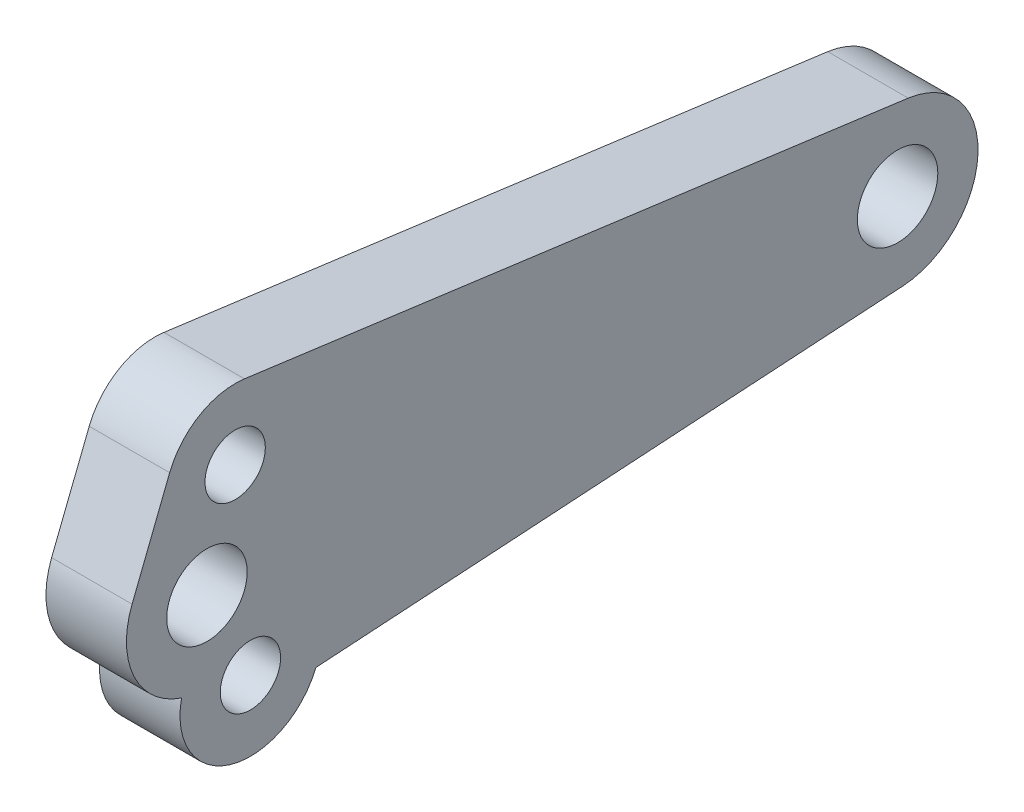
ISO-10303-21;
HEADER;
FILE_DESCRIPTION(('STEP AP214'),'2;1');
FILE_NAME('part.step','',(''),(''),'','','');
FILE_SCHEMA(('AUTOMOTIVE_DESIGN { 1 0 10303 214 1 1 1 1 }'));
ENDSEC;
DATA;
#1=APPLICATION_CONTEXT('core data for automotive mechanical design processes');
#2=APPLICATION_PROTOCOL_DEFINITION('international standard','automotive_design',2000,#1);
#3=PRODUCT_CONTEXT('',#1,'mechanical');
#4=PRODUCT('Part','Part','',(#3));
#5=PRODUCT_RELATED_PRODUCT_CATEGORY('part','',(#4));
#6=PRODUCT_DEFINITION_FORMATION('','',#4);
#7=PRODUCT_DEFINITION_CONTEXT('part definition',#1,'design');
#8=PRODUCT_DEFINITION('design','',#6,#7);
#9=PRODUCT_DEFINITION_SHAPE('','',#8);
#10=(LENGTH_UNIT() NAMED_UNIT(*) SI_UNIT(.MILLI.,.METRE.));
#11=(NAMED_UNIT(*) PLANE_ANGLE_UNIT() SI_UNIT($,.RADIAN.));
#12=(NAMED_UNIT(*) SI_UNIT($,.STERADIAN.) SOLID_ANGLE_UNIT());
#13=UNCERTAINTY_MEASURE_WITH_UNIT(LENGTH_MEASURE(1.E-05),#10,'distance_accuracy_value','');
#14=(GEOMETRIC_REPRESENTATION_CONTEXT(3) GLOBAL_UNCERTAINTY_ASSIGNED_CONTEXT((#13)) GLOBAL_UNIT_ASSIGNED_CONTEXT((#10,
#11,#12)) REPRESENTATION_CONTEXT('',''));
#15=CARTESIAN_POINT('',(0.,0.,0.));
#16=DIRECTION('',(0.,0.,1.));
#17=DIRECTION('',(1.,0.,0.));
#18=AXIS2_PLACEMENT_3D('',#15,#16,#17);
#19=CARTESIAN_POINT('',(2.,2.45323711491328,-0.701399079253571));
#20=DIRECTION('',(1.,0.,0.));
#21=DIRECTION('',(0.,0.,-1.));
#22=AXIS2_PLACEMENT_3D('',#19,#20,#21);
#23=PLANE('',#22);
#24=CARTESIAN_POINT('',(2.,2.45323711491328,-0.701399079253571));
#25=DIRECTION('',(1.,0.,0.));
#26=DIRECTION('',(0.,0.,-1.));
#27=AXIS2_PLACEMENT_3D('',#24,#25,#26);
#28=CIRCLE('',#27,0.75);
#29=CARTESIAN_POINT('',(2.,2.45323711491328,-1.45139907925357));
#30=VERTEX_POINT('',#29);
#31=EDGE_CURVE('E200',#30,#30,#28,.T.);
#32=ORIENTED_EDGE('',*,*,#31,.F.);
#33=EDGE_LOOP('',(#32));
#34=FACE_BOUND('',#33,.T.);
#35=CARTESIAN_POINT('',(2.,0.,0.));
#36=DIRECTION('',(1.,0.,0.));
#37=DIRECTION('',(0.,0.,-1.));
#38=AXIS2_PLACEMENT_3D('',#35,#36,#37);
#39=CIRCLE('',#38,1.);
#40=CARTESIAN_POINT('',(2.,0.,-1.));
#41=VERTEX_POINT('',#40);
#42=EDGE_CURVE('E140',#41,#41,#39,.T.);
#43=ORIENTED_EDGE('',*,*,#42,.F.);
#44=EDGE_LOOP('',(#43));
#45=FACE_BOUND('',#44,.T.);
#46=CARTESIAN_POINT('',(2.,2.45323711491328,-0.701399079253571));
#47=DIRECTION('',(1.,0.,0.));
#48=DIRECTION('',(0.,0.,-1.));
#49=AXIS2_PLACEMENT_3D('',#46,#47,#48);
#50=CIRCLE('',#49,1.75);
#51=CARTESIAN_POINT('',(2.,4.1877997157229,-0.933331362199626));
#52=VERTEX_POINT('',#51);
#53=CARTESIAN_POINT('',(2.,3.09684471709223,0.925951299250538));
#54=VERTEX_POINT('',#53);
#55=EDGE_CURVE('E155',#52,#54,#50,.T.);
#56=ORIENTED_EDGE('',*,*,#55,.T.);
#57=DIRECTION('',(0.,-0.929914502002348,0.367775772673683));
#58=VECTOR('',#57,1.);
#59=CARTESIAN_POINT('',(2.,3.09684471709223,0.925951299250538));
#60=LINE('',#59,#58);
#61=CARTESIAN_POINT('',(2.,0.735551545347367,1.8598290040047));
#62=VERTEX_POINT('',#61);
#63=EDGE_CURVE('E97',#54,#62,#60,.T.);
#64=ORIENTED_EDGE('',*,*,#63,.T.);
#65=CARTESIAN_POINT('',(2.,0.,0.));
#66=DIRECTION('',(1.,0.,0.));
#67=DIRECTION('',(0.,0.,-1.));
#68=AXIS2_PLACEMENT_3D('',#65,#66,#67);
#69=CIRCLE('',#68,2.);
#70=CARTESIAN_POINT('',(2.,-1.89794479683448,0.630718279558265));
#71=VERTEX_POINT('',#70);
#72=EDGE_CURVE('E172',#62,#71,#69,.T.);
#73=ORIENTED_EDGE('',*,*,#72,.T.);
#74=CARTESIAN_POINT('',(2.,-2.26193109555407,-1.08101007924882));
#75=DIRECTION('',(1.,0.,0.));
#76=DIRECTION('',(0.,0.,-1.));
#77=AXIS2_PLACEMENT_3D('',#74,#75,#76);
#78=CIRCLE('',#77,1.75);
#79=CARTESIAN_POINT('',(2.,-2.91139936514957,-2.70603037659548));
#80=VERTEX_POINT('',#79);
#81=EDGE_CURVE('E113',#71,#80,#78,.T.);
#82=ORIENTED_EDGE('',*,*,#81,.T.);
#83=DIRECTION('',(0.,0.0626500320146825,-0.998035557226575));
#84=VECTOR('',#83,1.);
#85=CARTESIAN_POINT('',(2.,-2.91139936514957,-2.70603037659548));
#86=LINE('',#85,#84);
#87=CARTESIAN_POINT('',(2.,-1.99607111445315,-17.2875096089594));
#88=VERTEX_POINT('',#87);
#89=EDGE_CURVE('E107',#80,#88,#86,.T.);
#90=ORIENTED_EDGE('',*,*,#89,.T.);
#91=CARTESIAN_POINT('',(2.,0.,-17.16220954493));
#92=DIRECTION('',(1.,0.,0.));
#93=DIRECTION('',(0.,0.,-1.));
#94=AXIS2_PLACEMENT_3D('',#91,#92,#93);
#95=CIRCLE('',#94,2.);
#96=CARTESIAN_POINT('',(2.,1.98235725806814,-17.4272750111541));
#97=VERTEX_POINT('',#96);
#98=EDGE_CURVE('E111',#88,#97,#95,.T.);
#99=ORIENTED_EDGE('',*,*,#98,.T.);
#100=DIRECTION('',(0.,0.132532733112032,0.991178629034068));
#101=VECTOR('',#100,1.);
#102=CARTESIAN_POINT('',(2.,4.1877997157229,-0.933331362199626));
#103=LINE('',#102,#101);
#104=EDGE_CURVE('E57',#97,#52,#103,.T.);
#105=ORIENTED_EDGE('',*,*,#104,.T.);
#106=EDGE_LOOP('',(#56,#64,#73,#82,#90,#99,#105));
#107=FACE_BOUND('',#106,.T.);
#108=CARTESIAN_POINT('',(2.,0.,-17.16220954493));
#109=DIRECTION('',(1.,0.,0.));
#110=DIRECTION('',(0.,0.,-1.));
#111=AXIS2_PLACEMENT_3D('',#108,#109,#110);
#112=CIRCLE('',#111,1.);
#113=CARTESIAN_POINT('',(2.,0.,-18.16220954493));
#114=VERTEX_POINT('',#113);
#115=EDGE_CURVE('E192',#114,#114,#112,.T.);
#116=ORIENTED_EDGE('',*,*,#115,.F.);
#117=EDGE_LOOP('',(#116));
#118=FACE_BOUND('',#117,.T.);
#119=CARTESIAN_POINT('',(2.,-2.26193109555407,-1.08101007924882));
#120=DIRECTION('',(1.,0.,0.));
#121=DIRECTION('',(0.,0.,-1.));
#122=AXIS2_PLACEMENT_3D('',#119,#120,#121);
#123=CIRCLE('',#122,0.75);
#124=CARTESIAN_POINT('',(2.,-2.26193109555407,-1.83101007924882));
#125=VERTEX_POINT('',#124);
#126=EDGE_CURVE('E208',#125,#125,#123,.T.);
#127=ORIENTED_EDGE('',*,*,#126,.F.);
#128=EDGE_LOOP('',(#127));
#129=FACE_BOUND('',#128,.T.);
#130=ADVANCED_FACE('F39',(#34,#45,#107,#118,#129),#23,.T.);
#131=CARTESIAN_POINT('',(0.,2.45323711491328,-0.701399079253571));
#132=DIRECTION('',(1.,0.,0.));
#133=DIRECTION('',(0.,0.,-1.));
#134=AXIS2_PLACEMENT_3D('',#131,#132,#133);
#135=PLANE('',#134);
#136=CARTESIAN_POINT('',(0.,2.45323711491328,-0.701399079253571));
#137=DIRECTION('',(1.,0.,0.));
#138=DIRECTION('',(0.,0.,-1.));
#139=AXIS2_PLACEMENT_3D('',#136,#137,#138);
#140=CIRCLE('',#139,1.75);
#141=CARTESIAN_POINT('',(0.,4.1877997157229,-0.933331362199626));
#142=VERTEX_POINT('',#141);
#143=CARTESIAN_POINT('',(0.,3.09684471709223,0.925951299250538));
#144=VERTEX_POINT('',#143);
#145=EDGE_CURVE('E135',#142,#144,#140,.T.);
#146=ORIENTED_EDGE('',*,*,#145,.F.);
#147=DIRECTION('',(0.,0.132532733112032,0.991178629034068));
#148=VECTOR('',#147,1.);
#149=CARTESIAN_POINT('',(0.,4.1877997157229,-0.933331362199626));
#150=LINE('',#149,#148);
#151=CARTESIAN_POINT('',(0.,1.98235725806814,-17.4272750111541));
#152=VERTEX_POINT('',#151);
#153=EDGE_CURVE('E89',#152,#142,#150,.T.);
#154=ORIENTED_EDGE('',*,*,#153,.F.);
#155=CARTESIAN_POINT('',(0.,0.,-17.16220954493));
#156=DIRECTION('',(1.,0.,0.));
#157=DIRECTION('',(0.,0.,-1.));
#158=AXIS2_PLACEMENT_3D('',#155,#156,#157);
#159=CIRCLE('',#158,2.);
#160=CARTESIAN_POINT('',(0.,-1.99607111445315,-17.2875096089594));
#161=VERTEX_POINT('',#160);
#162=EDGE_CURVE('E83',#161,#152,#159,.T.);
#163=ORIENTED_EDGE('',*,*,#162,.F.);
#164=DIRECTION('',(0.,0.0626500320146825,-0.998035557226575));
#165=VECTOR('',#164,1.);
#166=CARTESIAN_POINT('',(0.,-2.91139936514957,-2.70603037659548));
#167=LINE('',#166,#165);
#168=CARTESIAN_POINT('',(0.,-2.91139936514957,-2.70603037659548));
#169=VERTEX_POINT('',#168);
#170=EDGE_CURVE('E122',#169,#161,#167,.T.);
#171=ORIENTED_EDGE('',*,*,#170,.F.);
#172=CARTESIAN_POINT('',(0.,-2.26193109555407,-1.08101007924882));
#173=DIRECTION('',(1.,0.,0.));
#174=DIRECTION('',(0.,0.,-1.));
#175=AXIS2_PLACEMENT_3D('',#172,#173,#174);
#176=CIRCLE('',#175,1.75);
#177=CARTESIAN_POINT('',(0.,-1.89794479683448,0.630718279558265));
#178=VERTEX_POINT('',#177);
#179=EDGE_CURVE('E146',#178,#169,#176,.T.);
#180=ORIENTED_EDGE('',*,*,#179,.F.);
#181=CARTESIAN_POINT('',(0.,0.,0.));
#182=DIRECTION('',(1.,0.,0.));
#183=DIRECTION('',(0.,0.,-1.));
#184=AXIS2_PLACEMENT_3D('',#181,#182,#183);
#185=CIRCLE('',#184,2.);
#186=CARTESIAN_POINT('',(0.,0.735551545347367,1.8598290040047));
#187=VERTEX_POINT('',#186);
#188=EDGE_CURVE('E143',#187,#178,#185,.T.);
#189=ORIENTED_EDGE('',*,*,#188,.F.);
#190=DIRECTION('',(0.,-0.929914502002348,0.367775772673683));
#191=VECTOR('',#190,1.);
#192=CARTESIAN_POINT('',(0.,3.09684471709223,0.925951299250538));
#193=LINE('',#192,#191);
#194=EDGE_CURVE('E139',#144,#187,#193,.T.);
#195=ORIENTED_EDGE('',*,*,#194,.F.);
#196=EDGE_LOOP('',(#146,#154,#163,#171,#180,#189,#195));
#197=FACE_BOUND('',#196,.T.);
#198=CARTESIAN_POINT('',(0.,0.,0.));
#199=DIRECTION('',(1.,0.,0.));
#200=DIRECTION('',(0.,0.,-1.));
#201=AXIS2_PLACEMENT_3D('',#198,#199,#200);
#202=CIRCLE('',#201,1.);
#203=CARTESIAN_POINT('',(0.,0.,-1.));
#204=VERTEX_POINT('',#203);
#205=EDGE_CURVE('E188',#204,#204,#202,.T.);
#206=ORIENTED_EDGE('',*,*,#205,.T.);
#207=EDGE_LOOP('',(#206));
#208=FACE_BOUND('',#207,.T.);
#209=CARTESIAN_POINT('',(0.,0.,-17.16220954493));
#210=DIRECTION('',(1.,0.,0.));
#211=DIRECTION('',(0.,0.,-1.));
#212=AXIS2_PLACEMENT_3D('',#209,#210,#211);
#213=CIRCLE('',#212,1.);
#214=CARTESIAN_POINT('',(0.,0.,-18.16220954493));
#215=VERTEX_POINT('',#214);
#216=EDGE_CURVE('E196',#215,#215,#213,.T.);
#217=ORIENTED_EDGE('',*,*,#216,.T.);
#218=EDGE_LOOP('',(#217));
#219=FACE_BOUND('',#218,.T.);
#220=CARTESIAN_POINT('',(0.,2.45323711491328,-0.701399079253571));
#221=DIRECTION('',(1.,0.,0.));
#222=DIRECTION('',(0.,0.,-1.));
#223=AXIS2_PLACEMENT_3D('',#220,#221,#222);
#224=CIRCLE('',#223,0.75);
#225=CARTESIAN_POINT('',(0.,2.45323711491328,-1.45139907925357));
#226=VERTEX_POINT('',#225);
#227=EDGE_CURVE('E204',#226,#226,#224,.T.);
#228=ORIENTED_EDGE('',*,*,#227,.T.);
#229=EDGE_LOOP('',(#228));
#230=FACE_BOUND('',#229,.T.);
#231=CARTESIAN_POINT('',(0.,-2.26193109555407,-1.08101007924882));
#232=DIRECTION('',(1.,0.,0.));
#233=DIRECTION('',(0.,0.,-1.));
#234=AXIS2_PLACEMENT_3D('',#231,#232,#233);
#235=CIRCLE('',#234,0.75);
#236=CARTESIAN_POINT('',(0.,-2.26193109555407,-1.83101007924882));
#237=VERTEX_POINT('',#236);
#238=EDGE_CURVE('E212',#237,#237,#235,.T.);
#239=ORIENTED_EDGE('',*,*,#238,.T.);
#240=EDGE_LOOP('',(#239));
#241=FACE_BOUND('',#240,.T.);
#242=ADVANCED_FACE('F176',(#197,#208,#219,#230,#241),#135,.F.);
#243=CARTESIAN_POINT('',(2.,2.45323711491328,-0.701399079253571));
#244=DIRECTION('',(-1.,0.,0.));
#245=DIRECTION('',(0.,0.,1.));
#246=AXIS2_PLACEMENT_3D('',#243,#244,#245);
#247=CYLINDRICAL_SURFACE('',#246,1.75);
#248=ORIENTED_EDGE('',*,*,#145,.T.);
#249=DIRECTION('',(-1.,0.,0.));
#250=VECTOR('',#249,1.);
#251=CARTESIAN_POINT('',(2.,3.09684471709223,0.925951299250538));
#252=LINE('',#251,#250);
#253=EDGE_CURVE('E11',#54,#144,#252,.T.);
#254=ORIENTED_EDGE('',*,*,#253,.F.);
#255=ORIENTED_EDGE('',*,*,#55,.F.);
#256=DIRECTION('',(-1.,0.,0.));
#257=VECTOR('',#256,1.);
#258=CARTESIAN_POINT('',(2.,4.1877997157229,-0.933331362199626));
#259=LINE('',#258,#257);
#260=EDGE_CURVE('E131',#52,#142,#259,.T.);
#261=ORIENTED_EDGE('',*,*,#260,.T.);
#262=EDGE_LOOP('',(#248,#254,#255,#261));
#263=FACE_BOUND('',#262,.T.);
#264=ADVANCED_FACE('F41',(#263),#247,.T.);
#265=CARTESIAN_POINT('',(2.,3.09684471709223,0.925951299250538));
#266=DIRECTION('',(0.,-0.367775772673683,-0.929914502002348));
#267=DIRECTION('',(0.,0.929914502002348,-0.367775772673683));
#268=AXIS2_PLACEMENT_3D('',#265,#266,#267);
#269=PLANE('',#268);
#270=ORIENTED_EDGE('',*,*,#194,.T.);
#271=DIRECTION('',(-1.,0.,0.));
#272=VECTOR('',#271,1.);
#273=CARTESIAN_POINT('',(2.,0.735551545347367,1.8598290040047));
#274=LINE('',#273,#272);
#275=EDGE_CURVE('E49',#62,#187,#274,.T.);
#276=ORIENTED_EDGE('',*,*,#275,.F.);
#277=ORIENTED_EDGE('',*,*,#63,.F.);
#278=ORIENTED_EDGE('',*,*,#253,.T.);
#279=EDGE_LOOP('',(#270,#276,#277,#278));
#280=FACE_BOUND('',#279,.T.);
#281=ADVANCED_FACE('F246',(#280),#269,.F.);
#282=CARTESIAN_POINT('',(2.,0.,0.));
#283=DIRECTION('',(-1.,0.,0.));
#284=DIRECTION('',(0.,0.,1.));
#285=AXIS2_PLACEMENT_3D('',#282,#283,#284);
#286=CYLINDRICAL_SURFACE('',#285,2.);
#287=ORIENTED_EDGE('',*,*,#188,.T.);
#288=DIRECTION('',(-1.,0.,0.));
#289=VECTOR('',#288,1.);
#290=CARTESIAN_POINT('',(2.,-1.89794479683448,0.630718279558265));
#291=LINE('',#290,#289);
#292=EDGE_CURVE('E162',#71,#178,#291,.T.);
#293=ORIENTED_EDGE('',*,*,#292,.F.);
#294=ORIENTED_EDGE('',*,*,#72,.F.);
#295=ORIENTED_EDGE('',*,*,#275,.T.);
#296=EDGE_LOOP('',(#287,#293,#294,#295));
#297=FACE_BOUND('',#296,.T.);
#298=ADVANCED_FACE('F170',(#297),#286,.T.);
#299=CARTESIAN_POINT('',(2.,-2.26193109555407,-1.08101007924882));
#300=DIRECTION('',(-1.,0.,0.));
#301=DIRECTION('',(0.,0.,1.));
#302=AXIS2_PLACEMENT_3D('',#299,#300,#301);
#303=CYLINDRICAL_SURFACE('',#302,1.75);
#304=ORIENTED_EDGE('',*,*,#179,.T.);
#305=DIRECTION('',(-1.,0.,0.));
#306=VECTOR('',#305,1.);
#307=CARTESIAN_POINT('',(2.,-2.91139936514957,-2.70603037659548));
#308=LINE('',#307,#306);
#309=EDGE_CURVE('E124',#80,#169,#308,.T.);
#310=ORIENTED_EDGE('',*,*,#309,.F.);
#311=ORIENTED_EDGE('',*,*,#81,.F.);
#312=ORIENTED_EDGE('',*,*,#292,.T.);
#313=EDGE_LOOP('',(#304,#310,#311,#312));
#314=FACE_BOUND('',#313,.T.);
#315=ADVANCED_FACE('F179',(#314),#303,.T.);
#316=CARTESIAN_POINT('',(2.,-2.91139936514957,-2.70603037659548));
#317=DIRECTION('',(0.,0.998035557226575,0.0626500320146825));
#318=DIRECTION('',(0.,-0.0626500320146825,0.998035557226575));
#319=AXIS2_PLACEMENT_3D('',#316,#317,#318);
#320=PLANE('',#319);
#321=ORIENTED_EDGE('',*,*,#170,.T.);
#322=DIRECTION('',(-1.,0.,0.));
#323=VECTOR('',#322,1.);
#324=CARTESIAN_POINT('',(2.,-1.99607111445315,-17.2875096089594));
#325=LINE('',#324,#323);
#326=EDGE_CURVE('E119',#88,#161,#325,.T.);
#327=ORIENTED_EDGE('',*,*,#326,.F.);
#328=ORIENTED_EDGE('',*,*,#89,.F.);
#329=ORIENTED_EDGE('',*,*,#309,.T.);
#330=EDGE_LOOP('',(#321,#327,#328,#329));
#331=FACE_BOUND('',#330,.T.);
#332=ADVANCED_FACE('F120',(#331),#320,.F.);
#333=CARTESIAN_POINT('',(2.,0.,-17.16220954493));
#334=DIRECTION('',(-1.,0.,0.));
#335=DIRECTION('',(0.,0.,1.));
#336=AXIS2_PLACEMENT_3D('',#333,#334,#335);
#337=CYLINDRICAL_SURFACE('',#336,2.);
#338=ORIENTED_EDGE('',*,*,#162,.T.);
#339=DIRECTION('',(-1.,0.,0.));
#340=VECTOR('',#339,1.);
#341=CARTESIAN_POINT('',(2.,1.98235725806814,-17.4272750111541));
#342=LINE('',#341,#340);
#343=EDGE_CURVE('E125',#97,#152,#342,.T.);
#344=ORIENTED_EDGE('',*,*,#343,.F.);
#345=ORIENTED_EDGE('',*,*,#98,.F.);
#346=ORIENTED_EDGE('',*,*,#326,.T.);
#347=EDGE_LOOP('',(#338,#344,#345,#346));
#348=FACE_BOUND('',#347,.T.);
#349=ADVANCED_FACE('F127',(#348),#337,.T.);
#350=CARTESIAN_POINT('',(2.,4.1877997157229,-0.933331362199626));
#351=DIRECTION('',(0.,-0.991178629034068,0.132532733112032));
#352=DIRECTION('',(0.,-0.132532733112032,-0.991178629034068));
#353=AXIS2_PLACEMENT_3D('',#350,#351,#352);
#354=PLANE('',#353);
#355=ORIENTED_EDGE('',*,*,#153,.T.);
#356=ORIENTED_EDGE('',*,*,#260,.F.);
#357=ORIENTED_EDGE('',*,*,#104,.F.);
#358=ORIENTED_EDGE('',*,*,#343,.T.);
#359=EDGE_LOOP('',(#355,#356,#357,#358));
#360=FACE_BOUND('',#359,.T.);
#361=ADVANCED_FACE('F236',(#360),#354,.F.);
#362=CARTESIAN_POINT('',(2.,0.,0.));
#363=DIRECTION('',(-1.,0.,0.));
#364=DIRECTION('',(0.,0.,1.));
#365=AXIS2_PLACEMENT_3D('',#362,#363,#364);
#366=CYLINDRICAL_SURFACE('',#365,1.);
#367=ORIENTED_EDGE('',*,*,#42,.T.);
#368=EDGE_LOOP('',(#367));
#369=FACE_BOUND('',#368,.T.);
#370=ORIENTED_EDGE('',*,*,#205,.F.);
#371=EDGE_LOOP('',(#370));
#372=FACE_BOUND('',#371,.T.);
#373=ADVANCED_FACE('F233',(#369,#372),#366,.F.);
#374=CARTESIAN_POINT('',(2.,0.,-17.16220954493));
#375=DIRECTION('',(-1.,0.,0.));
#376=DIRECTION('',(0.,0.,1.));
#377=AXIS2_PLACEMENT_3D('',#374,#375,#376);
#378=CYLINDRICAL_SURFACE('',#377,1.);
#379=ORIENTED_EDGE('',*,*,#115,.T.);
#380=EDGE_LOOP('',(#379));
#381=FACE_BOUND('',#380,.T.);
#382=ORIENTED_EDGE('',*,*,#216,.F.);
#383=EDGE_LOOP('',(#382));
#384=FACE_BOUND('',#383,.T.);
#385=ADVANCED_FACE('F305',(#381,#384),#378,.F.);
#386=CARTESIAN_POINT('',(2.,2.45323711491328,-0.701399079253571));
#387=DIRECTION('',(-1.,0.,0.));
#388=DIRECTION('',(0.,0.,1.));
#389=AXIS2_PLACEMENT_3D('',#386,#387,#388);
#390=CYLINDRICAL_SURFACE('',#389,0.75);
#391=ORIENTED_EDGE('',*,*,#31,.T.);
#392=EDGE_LOOP('',(#391));
#393=FACE_BOUND('',#392,.T.);
#394=ORIENTED_EDGE('',*,*,#227,.F.);
#395=EDGE_LOOP('',(#394));
#396=FACE_BOUND('',#395,.T.);
#397=ADVANCED_FACE('F313',(#393,#396),#390,.F.);
#398=CARTESIAN_POINT('',(2.,-2.26193109555407,-1.08101007924882));
#399=DIRECTION('',(-1.,0.,0.));
#400=DIRECTION('',(0.,0.,1.));
#401=AXIS2_PLACEMENT_3D('',#398,#399,#400);
#402=CYLINDRICAL_SURFACE('',#401,0.75);
#403=ORIENTED_EDGE('',*,*,#126,.T.);
#404=EDGE_LOOP('',(#403));
#405=FACE_BOUND('',#404,.T.);
#406=ORIENTED_EDGE('',*,*,#238,.F.);
#407=EDGE_LOOP('',(#406));
#408=FACE_BOUND('',#407,.T.);
#409=ADVANCED_FACE('F220',(#405,#408),#402,.F.);
#410=CLOSED_SHELL('',(#130,#242,#264,#281,#298,#315,#332,#349,#361,#373,#385,#397,#409));
#411=MANIFOLD_SOLID_BREP('B2',#410);
#412=ADVANCED_BREP_SHAPE_REPRESENTATION('',(#18,#411),#14);
#413=SHAPE_DEFINITION_REPRESENTATION(#9,#412);
ENDSEC;
END-ISO-10303-21;
